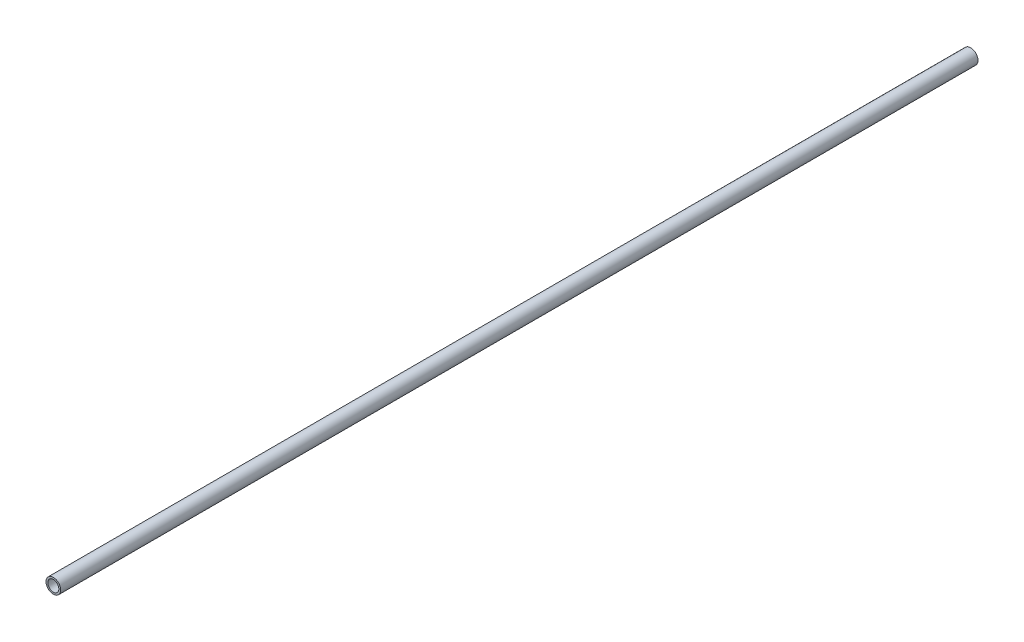
ISO-10303-21;
HEADER;
FILE_DESCRIPTION(('STEP AP214'),'2;1');
FILE_NAME('part.step','',(''),(''),'','','');
FILE_SCHEMA(('AUTOMOTIVE_DESIGN { 1 0 10303 214 1 1 1 1 }'));
ENDSEC;
DATA;
#1=APPLICATION_CONTEXT('core data for automotive mechanical design processes');
#2=APPLICATION_PROTOCOL_DEFINITION('international standard','automotive_design',2000,#1);
#3=PRODUCT_CONTEXT('',#1,'mechanical');
#4=PRODUCT('Part','Part','',(#3));
#5=PRODUCT_RELATED_PRODUCT_CATEGORY('part','',(#4));
#6=PRODUCT_DEFINITION_FORMATION('','',#4);
#7=PRODUCT_DEFINITION_CONTEXT('part definition',#1,'design');
#8=PRODUCT_DEFINITION('design','',#6,#7);
#9=PRODUCT_DEFINITION_SHAPE('','',#8);
#10=(LENGTH_UNIT() NAMED_UNIT(*) SI_UNIT(.MILLI.,.METRE.));
#11=(NAMED_UNIT(*) PLANE_ANGLE_UNIT() SI_UNIT($,.RADIAN.));
#12=(NAMED_UNIT(*) SI_UNIT($,.STERADIAN.) SOLID_ANGLE_UNIT());
#13=UNCERTAINTY_MEASURE_WITH_UNIT(LENGTH_MEASURE(1.E-05),#10,'distance_accuracy_value','');
#14=(GEOMETRIC_REPRESENTATION_CONTEXT(3) GLOBAL_UNCERTAINTY_ASSIGNED_CONTEXT((#13)) GLOBAL_UNIT_ASSIGNED_CONTEXT((#10,
#11,#12)) REPRESENTATION_CONTEXT('',''));
#15=CARTESIAN_POINT('',(0.,0.,0.));
#16=DIRECTION('',(0.,0.,1.));
#17=DIRECTION('',(1.,0.,0.));
#18=AXIS2_PLACEMENT_3D('',#15,#16,#17);
#19=CARTESIAN_POINT('',(0.,0.,500.));
#20=DIRECTION('',(0.,0.,1.));
#21=DIRECTION('',(1.,0.,0.));
#22=AXIS2_PLACEMENT_3D('',#19,#20,#21);
#23=PLANE('',#22);
#24=CARTESIAN_POINT('',(0.,0.,500.));
#25=DIRECTION('',(0.,0.,1.));
#26=DIRECTION('',(1.,0.,0.));
#27=AXIS2_PLACEMENT_3D('',#24,#25,#26);
#28=CIRCLE('',#27,4.);
#29=CARTESIAN_POINT('',(4.,0.,500.));
#30=VERTEX_POINT('',#29);
#31=EDGE_CURVE('E10',#30,#30,#28,.T.);
#32=ORIENTED_EDGE('',*,*,#31,.T.);
#33=EDGE_LOOP('',(#32));
#34=FACE_BOUND('',#33,.T.);
#35=CARTESIAN_POINT('',(0.,0.,500.));
#36=DIRECTION('',(0.,0.,1.));
#37=DIRECTION('',(1.,0.,0.));
#38=AXIS2_PLACEMENT_3D('',#35,#36,#37);
#39=CIRCLE('',#38,3.);
#40=CARTESIAN_POINT('',(3.,0.,500.));
#41=VERTEX_POINT('',#40);
#42=EDGE_CURVE('E45',#41,#41,#39,.T.);
#43=ORIENTED_EDGE('',*,*,#42,.F.);
#44=EDGE_LOOP('',(#43));
#45=FACE_BOUND('',#44,.T.);
#46=ADVANCED_FACE('F34',(#34,#45),#23,.T.);
#47=CARTESIAN_POINT('',(0.,0.,0.));
#48=DIRECTION('',(0.,0.,1.));
#49=DIRECTION('',(1.,0.,0.));
#50=AXIS2_PLACEMENT_3D('',#47,#48,#49);
#51=PLANE('',#50);
#52=CARTESIAN_POINT('',(0.,0.,0.));
#53=DIRECTION('',(0.,0.,1.));
#54=DIRECTION('',(1.,0.,0.));
#55=AXIS2_PLACEMENT_3D('',#52,#53,#54);
#56=CIRCLE('',#55,4.);
#57=CARTESIAN_POINT('',(4.,0.,0.));
#58=VERTEX_POINT('',#57);
#59=EDGE_CURVE('E38',#58,#58,#56,.T.);
#60=ORIENTED_EDGE('',*,*,#59,.F.);
#61=EDGE_LOOP('',(#60));
#62=FACE_BOUND('',#61,.T.);
#63=CARTESIAN_POINT('',(0.,0.,0.));
#64=DIRECTION('',(0.,0.,1.));
#65=DIRECTION('',(1.,0.,0.));
#66=AXIS2_PLACEMENT_3D('',#63,#64,#65);
#67=CIRCLE('',#66,3.);
#68=CARTESIAN_POINT('',(3.,0.,0.));
#69=VERTEX_POINT('',#68);
#70=EDGE_CURVE('E47',#69,#69,#67,.T.);
#71=ORIENTED_EDGE('',*,*,#70,.T.);
#72=EDGE_LOOP('',(#71));
#73=FACE_BOUND('',#72,.T.);
#74=ADVANCED_FACE('F57',(#62,#73),#51,.F.);
#75=CARTESIAN_POINT('',(0.,0.,500.));
#76=DIRECTION('',(0.,0.,-1.));
#77=DIRECTION('',(-1.,0.,0.));
#78=AXIS2_PLACEMENT_3D('',#75,#76,#77);
#79=CYLINDRICAL_SURFACE('',#78,4.);
#80=ORIENTED_EDGE('',*,*,#31,.F.);
#81=EDGE_LOOP('',(#80));
#82=FACE_BOUND('',#81,.T.);
#83=ORIENTED_EDGE('',*,*,#59,.T.);
#84=EDGE_LOOP('',(#83));
#85=FACE_BOUND('',#84,.T.);
#86=ADVANCED_FACE('F36',(#82,#85),#79,.T.);
#87=CARTESIAN_POINT('',(0.,0.,500.));
#88=DIRECTION('',(0.,0.,-1.));
#89=DIRECTION('',(-1.,0.,0.));
#90=AXIS2_PLACEMENT_3D('',#87,#88,#89);
#91=CYLINDRICAL_SURFACE('',#90,3.);
#92=ORIENTED_EDGE('',*,*,#42,.T.);
#93=EDGE_LOOP('',(#92));
#94=FACE_BOUND('',#93,.T.);
#95=ORIENTED_EDGE('',*,*,#70,.F.);
#96=EDGE_LOOP('',(#95));
#97=FACE_BOUND('',#96,.T.);
#98=ADVANCED_FACE('F53',(#94,#97),#91,.F.);
#99=CLOSED_SHELL('',(#46,#74,#86,#98));
#100=MANIFOLD_SOLID_BREP('B2',#99);
#101=ADVANCED_BREP_SHAPE_REPRESENTATION('',(#18,#100),#14);
#102=SHAPE_DEFINITION_REPRESENTATION(#9,#101);
ENDSEC;
END-ISO-10303-21;
